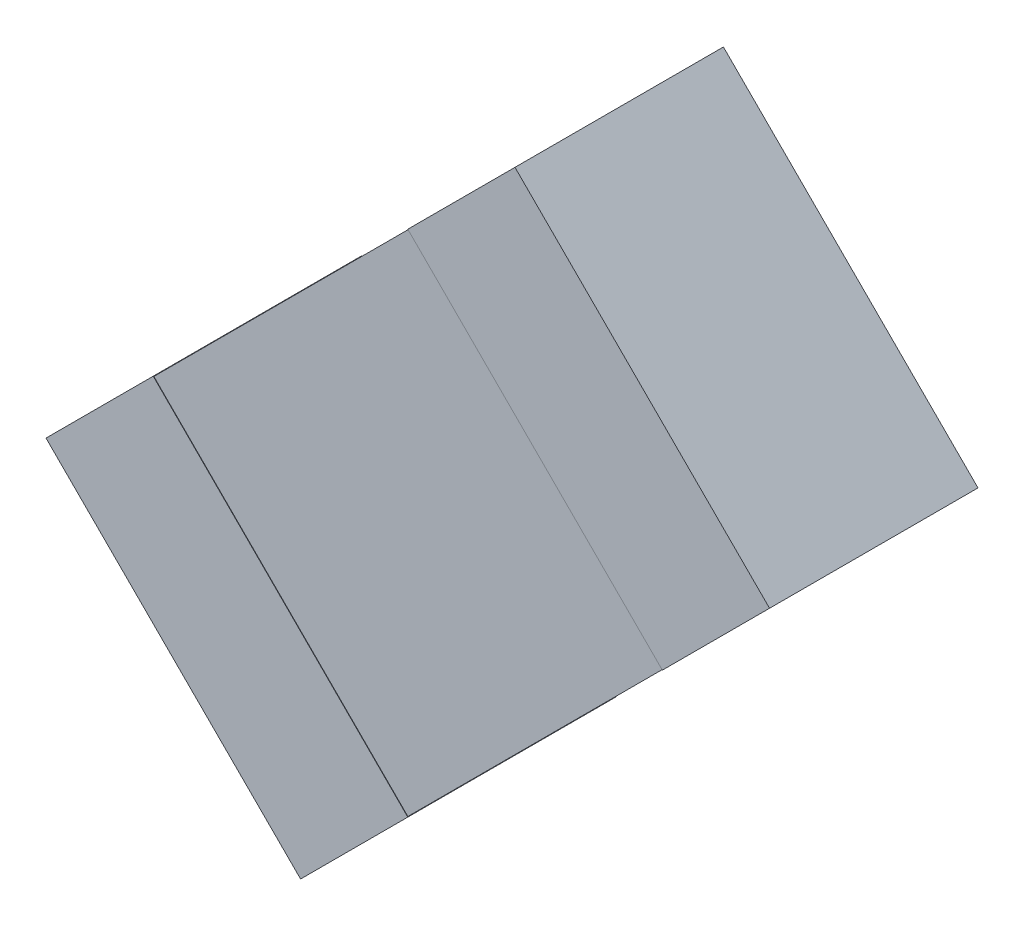
ISO-10303-21;
HEADER;
FILE_DESCRIPTION(('STEP AP214'),'2;1');
FILE_NAME('part.step','',(''),(''),'','','');
FILE_SCHEMA(('AUTOMOTIVE_DESIGN { 1 0 10303 214 1 1 1 1 }'));
ENDSEC;
DATA;
#1=APPLICATION_CONTEXT('core data for automotive mechanical design processes');
#2=APPLICATION_PROTOCOL_DEFINITION('international standard','automotive_design',2000,#1);
#3=PRODUCT_CONTEXT('',#1,'mechanical');
#4=PRODUCT('Part','Part','',(#3));
#5=PRODUCT_RELATED_PRODUCT_CATEGORY('part','',(#4));
#6=PRODUCT_DEFINITION_FORMATION('','',#4);
#7=PRODUCT_DEFINITION_CONTEXT('part definition',#1,'design');
#8=PRODUCT_DEFINITION('design','',#6,#7);
#9=PRODUCT_DEFINITION_SHAPE('','',#8);
#10=(LENGTH_UNIT() NAMED_UNIT(*) SI_UNIT(.MILLI.,.METRE.));
#11=(NAMED_UNIT(*) PLANE_ANGLE_UNIT() SI_UNIT($,.RADIAN.));
#12=(NAMED_UNIT(*) SI_UNIT($,.STERADIAN.) SOLID_ANGLE_UNIT());
#13=UNCERTAINTY_MEASURE_WITH_UNIT(LENGTH_MEASURE(1.E-05),#10,'distance_accuracy_value','');
#14=(GEOMETRIC_REPRESENTATION_CONTEXT(3) GLOBAL_UNCERTAINTY_ASSIGNED_CONTEXT((#13)) GLOBAL_UNIT_ASSIGNED_CONTEXT((#10,
#11,#12)) REPRESENTATION_CONTEXT('',''));
#15=CARTESIAN_POINT('',(0.,0.,0.));
#16=DIRECTION('',(0.,0.,1.));
#17=DIRECTION('',(1.,0.,0.));
#18=AXIS2_PLACEMENT_3D('',#15,#16,#17);
#19=CARTESIAN_POINT('',(26.0197262084034,0.55010577926265,2.53731114527116));
#20=DIRECTION('',(-0.707106721582045,0.707106840791045,0.));
#21=DIRECTION('',(0.,0.,-1.));
#22=AXIS2_PLACEMENT_3D('',#19,#20,#21);
#23=PLANE('',#22);
#24=DIRECTION('',(0.707106840791045,0.707106721582045,0.));
#25=VECTOR('',#24,1.);
#26=CARTESIAN_POINT('',(282868.172679483,282842.655375552,2.53731114527116));
#27=LINE('',#26,#25);
#28=CARTESIAN_POINT('',(25.7722388141082,0.302618426690659,2.53731114527122));
#29=VERTEX_POINT('',#28);
#30=CARTESIAN_POINT('',(26.0197262084035,0.550105779262705,2.53731114527122));
#31=VERTEX_POINT('',#30);
#32=EDGE_CURVE('E276',#29,#31,#27,.T.);
#33=ORIENTED_EDGE('',*,*,#32,.F.);
#34=DIRECTION('',(0.,0.,-1.));
#35=VECTOR('',#34,1.);
#36=CARTESIAN_POINT('',(25.7722388141081,0.302618426690548,291601.756716946));
#37=LINE('',#36,#35);
#38=CARTESIAN_POINT('',(25.7722388141082,0.302618426690659,2.58731114525904));
#39=VERTEX_POINT('',#38);
#40=EDGE_CURVE('E28',#39,#29,#37,.T.);
#41=ORIENTED_EDGE('',*,*,#40,.F.);
#42=DIRECTION('',(-0.707106840791045,-0.707106721582045,0.));
#43=VECTOR('',#42,1.);
#44=CARTESIAN_POINT('',(282868.172679483,282842.655375552,2.58731114525917));
#45=LINE('',#44,#43);
#46=CARTESIAN_POINT('',(26.0550815504344,0.585461115333197,2.58731114525904));
#47=VERTEX_POINT('',#46);
#48=EDGE_CURVE('E335',#47,#39,#45,.T.);
#49=ORIENTED_EDGE('',*,*,#48,.F.);
#50=DIRECTION('',(0.,0.,1.));
#51=VECTOR('',#50,1.);
#52=CARTESIAN_POINT('',(26.0550815504344,0.585461115333252,291601.756716946));
#53=LINE('',#52,#51);
#54=CARTESIAN_POINT('',(26.0550815504344,0.585461115333197,2.03731114528316));
#55=VERTEX_POINT('',#54);
#56=EDGE_CURVE('E1057',#55,#47,#53,.T.);
#57=ORIENTED_EDGE('',*,*,#56,.F.);
#58=DIRECTION('',(0.707106840791045,0.707106721582045,0.));
#59=VECTOR('',#58,1.);
#60=CARTESIAN_POINT('',(282868.172679483,282842.655375552,2.03731114528316));
#61=LINE('',#60,#59);
#62=CARTESIAN_POINT('',(25.7722388141082,0.302618426690659,2.03731114528316));
#63=VERTEX_POINT('',#62);
#64=EDGE_CURVE('E1075',#63,#55,#61,.T.);
#65=ORIENTED_EDGE('',*,*,#64,.F.);
#66=CARTESIAN_POINT('',(25.7722388141082,0.302618426690659,2.08731114526974));
#67=VERTEX_POINT('',#66);
#68=EDGE_CURVE('E340',#67,#63,#37,.T.);
#69=ORIENTED_EDGE('',*,*,#68,.F.);
#70=DIRECTION('',(-0.707106840791045,-0.707106721582045,0.));
#71=VECTOR('',#70,1.);
#72=CARTESIAN_POINT('',(282868.172679483,282842.655375552,2.08731114527062));
#73=LINE('',#72,#71);
#74=CARTESIAN_POINT('',(26.0197262084035,0.550105779262705,2.08731114526886));
#75=VERTEX_POINT('',#74);
#76=EDGE_CURVE('E397',#75,#67,#73,.T.);
#77=ORIENTED_EDGE('',*,*,#76,.F.);
#78=DIRECTION('',(0.,0.,-1.));
#79=VECTOR('',#78,1.);
#80=CARTESIAN_POINT('',(26.0197262084034,0.55010577926265,291601.756716946));
#81=LINE('',#80,#79);
#82=EDGE_CURVE('E342',#31,#75,#81,.T.);
#83=ORIENTED_EDGE('',*,*,#82,.F.);
#84=EDGE_LOOP('',(#33,#41,#49,#57,#65,#69,#77,#83));
#85=FACE_BOUND('',#84,.T.);
#86=ADVANCED_FACE('F17',(#85),#23,.T.);
#87=CARTESIAN_POINT('',(26.6914775939063,-0.121645719488833,2.53731114527116));
#88=DIRECTION('',(-0.707106721582045,0.707106840791045,0.));
#89=DIRECTION('',(0.,0.,-1.));
#90=AXIS2_PLACEMENT_3D('',#87,#88,#89);
#91=PLANE('',#90);
#92=DIRECTION('',(0.707106840791045,0.707106721582045,0.));
#93=VECTOR('',#92,1.);
#94=CARTESIAN_POINT('',(282868.844430869,282841.983624053,2.53731114527116));
#95=LINE('',#94,#93);
#96=CARTESIAN_POINT('',(26.4439901996111,-0.369133072060837,2.53731114527122));
#97=VERTEX_POINT('',#96);
#98=CARTESIAN_POINT('',(26.6914775939064,-0.121645719488778,2.53731114527122));
#99=VERTEX_POINT('',#98);
#100=EDGE_CURVE('E252',#97,#99,#95,.T.);
#101=ORIENTED_EDGE('',*,*,#100,.T.);
#102=DIRECTION('',(0.,0.,-1.));
#103=VECTOR('',#102,1.);
#104=CARTESIAN_POINT('',(26.6914775939063,-0.121645719488833,291601.756716946));
#105=LINE('',#104,#103);
#106=CARTESIAN_POINT('',(26.6914775939064,-0.121645719488778,2.08731114526886));
#107=VERTEX_POINT('',#106);
#108=EDGE_CURVE('E283',#99,#107,#105,.T.);
#109=ORIENTED_EDGE('',*,*,#108,.T.);
#110=DIRECTION('',(-0.707106840791045,-0.707106721582045,0.));
#111=VECTOR('',#110,1.);
#112=CARTESIAN_POINT('',(26.6914775939063,-0.121645719488833,2.08731114527062));
#113=LINE('',#112,#111);
#114=CARTESIAN_POINT('',(26.4439901996111,-0.369133072060837,2.08731114526974));
#115=VERTEX_POINT('',#114);
#116=EDGE_CURVE('E369',#107,#115,#113,.T.);
#117=ORIENTED_EDGE('',*,*,#116,.T.);
#118=DIRECTION('',(0.,0.,-1.));
#119=VECTOR('',#118,1.);
#120=CARTESIAN_POINT('',(26.443990199611,-0.369133072060948,291601.756716946));
#121=LINE('',#120,#119);
#122=CARTESIAN_POINT('',(26.4439901996111,-0.369133072060837,2.03731114528316));
#123=VERTEX_POINT('',#122);
#124=EDGE_CURVE('E436',#115,#123,#121,.T.);
#125=ORIENTED_EDGE('',*,*,#124,.T.);
#126=DIRECTION('',(0.707106840791045,0.707106721582045,0.));
#127=VECTOR('',#126,1.);
#128=CARTESIAN_POINT('',(282868.844430869,282841.983624053,2.03731114528316));
#129=LINE('',#128,#127);
#130=CARTESIAN_POINT('',(26.7268329359373,-0.086290383418286,2.03731114528316));
#131=VERTEX_POINT('',#130);
#132=EDGE_CURVE('E1060',#123,#131,#129,.T.);
#133=ORIENTED_EDGE('',*,*,#132,.T.);
#134=DIRECTION('',(0.,0.,1.));
#135=VECTOR('',#134,1.);
#136=CARTESIAN_POINT('',(26.7268329359374,-0.0862903834182305,291601.756716946));
#137=LINE('',#136,#135);
#138=CARTESIAN_POINT('',(26.7268329359373,-0.086290383418286,2.58731114525904));
#139=VERTEX_POINT('',#138);
#140=EDGE_CURVE('E1050',#131,#139,#137,.T.);
#141=ORIENTED_EDGE('',*,*,#140,.T.);
#142=DIRECTION('',(-0.707106840791045,-0.707106721582045,0.));
#143=VECTOR('',#142,1.);
#144=CARTESIAN_POINT('',(282868.844430869,282841.983624053,2.58731114525917));
#145=LINE('',#144,#143);
#146=CARTESIAN_POINT('',(26.4439901996111,-0.369133072060837,2.58731114525904));
#147=VERTEX_POINT('',#146);
#148=EDGE_CURVE('E255',#139,#147,#145,.T.);
#149=ORIENTED_EDGE('',*,*,#148,.T.);
#150=EDGE_CURVE('E41',#147,#97,#121,.T.);
#151=ORIENTED_EDGE('',*,*,#150,.T.);
#152=EDGE_LOOP('',(#101,#109,#117,#125,#133,#141,#149,#151));
#153=FACE_BOUND('',#152,.T.);
#154=ADVANCED_FACE('F249',(#153),#91,.F.);
#155=CARTESIAN_POINT('',(26.443990199611,-0.369133072060948,291601.756716946));
#156=DIRECTION('',(0.707106840791045,0.707106721582045,0.));
#157=DIRECTION('',(0.,0.,1.));
#158=AXIS2_PLACEMENT_3D('',#155,#156,#157);
#159=PLANE('',#158);
#160=DIRECTION('',(-0.707106721582045,0.707106840791045,0.));
#161=VECTOR('',#160,1.);
#162=CARTESIAN_POINT('',(26.4425759861679,-0.367718858379356,2.58631114526117));
#163=LINE('',#162,#161);
#164=CARTESIAN_POINT('',(26.4432830928897,-0.368425965219993,2.58631114526117));
#165=VERTEX_POINT('',#164);
#166=CARTESIAN_POINT('',(25.7729459208297,0.301911319849746,2.58631114526124));
#167=VERTEX_POINT('',#166);
#168=EDGE_CURVE('E367',#165,#167,#163,.T.);
#169=ORIENTED_EDGE('',*,*,#168,.F.);
#170=DIRECTION('',(0.,0.,1.));
#171=VECTOR('',#170,1.);
#172=CARTESIAN_POINT('',(26.4432830928895,-0.36842596522016,2.08731114527062));
#173=LINE('',#172,#171);
#174=CARTESIAN_POINT('',(26.4432830928897,-0.368425965219993,2.53731114527116));
#175=VERTEX_POINT('',#174);
#176=EDGE_CURVE('E258',#165,#175,#173,.F.);
#177=ORIENTED_EDGE('',*,*,#176,.T.);
#178=DIRECTION('',(-0.707106721582045,0.707106840791045,0.));
#179=VECTOR('',#178,1.);
#180=CARTESIAN_POINT('',(26.443990199611,-0.369133072060948,2.53731114527116));
#181=LINE('',#180,#179);
#182=EDGE_CURVE('E261',#97,#175,#181,.T.);
#183=ORIENTED_EDGE('',*,*,#182,.F.);
#184=ORIENTED_EDGE('',*,*,#150,.F.);
#185=DIRECTION('',(-0.707106721582045,0.707106840791045,0.));
#186=VECTOR('',#185,1.);
#187=CARTESIAN_POINT('',(26.443990199611,-0.369133072060948,2.58731114525917));
#188=LINE('',#187,#186);
#189=EDGE_CURVE('E598',#147,#39,#188,.T.);
#190=ORIENTED_EDGE('',*,*,#189,.T.);
#191=ORIENTED_EDGE('',*,*,#40,.T.);
#192=CARTESIAN_POINT('',(25.7729459208098,0.3019113198299,2.5373111452712));
#193=VERTEX_POINT('',#192);
#194=EDGE_CURVE('E602',#193,#29,#181,.T.);
#195=ORIENTED_EDGE('',*,*,#194,.F.);
#196=DIRECTION('',(0.,0.,-1.));
#197=VECTOR('',#196,1.);
#198=CARTESIAN_POINT('',(25.7729459208297,0.301911319849746,291601.756716946));
#199=LINE('',#198,#197);
#200=EDGE_CURVE('E11',#193,#167,#199,.F.);
#201=ORIENTED_EDGE('',*,*,#200,.T.);
#202=EDGE_LOOP('',(#169,#177,#183,#184,#190,#191,#195,#201));
#203=FACE_BOUND('',#202,.T.);
#204=ADVANCED_FACE('F263',(#203),#159,.F.);
#205=CARTESIAN_POINT('',(282868.844430869,282841.983624053,2.58731114525917));
#206=DIRECTION('',(0.,0.,-1.));
#207=DIRECTION('',(0.707106840791045,0.707106721582045,0.));
#208=AXIS2_PLACEMENT_3D('',#205,#206,#207);
#209=PLANE('',#208);
#210=ORIENTED_EDGE('',*,*,#48,.T.);
#211=ORIENTED_EDGE('',*,*,#189,.F.);
#212=ORIENTED_EDGE('',*,*,#148,.F.);
#213=DIRECTION('',(-0.707106721582045,0.707106840791045,0.));
#214=VECTOR('',#213,1.);
#215=CARTESIAN_POINT('',(26.7268329359374,-0.0862903834182305,2.58731114525917));
#216=LINE('',#215,#214);
#217=EDGE_CURVE('E1047',#139,#47,#216,.T.);
#218=ORIENTED_EDGE('',*,*,#217,.T.);
#219=EDGE_LOOP('',(#210,#211,#212,#218));
#220=FACE_BOUND('',#219,.T.);
#221=ADVANCED_FACE('F703',(#220),#209,.F.);
#222=CARTESIAN_POINT('',(26.7268329359374,-0.0862903834182305,291601.756716946));
#223=DIRECTION('',(-0.707106840791045,-0.707106721582045,0.));
#224=DIRECTION('',(0.,0.,-1.));
#225=AXIS2_PLACEMENT_3D('',#222,#223,#224);
#226=PLANE('',#225);
#227=ORIENTED_EDGE('',*,*,#56,.T.);
#228=ORIENTED_EDGE('',*,*,#217,.F.);
#229=ORIENTED_EDGE('',*,*,#140,.F.);
#230=DIRECTION('',(-0.707106721582045,0.707106840791045,0.));
#231=VECTOR('',#230,1.);
#232=CARTESIAN_POINT('',(26.7268329359374,-0.0862903834182305,2.03731114528316));
#233=LINE('',#232,#231);
#234=EDGE_CURVE('E1081',#131,#55,#233,.T.);
#235=ORIENTED_EDGE('',*,*,#234,.T.);
#236=EDGE_LOOP('',(#227,#228,#229,#235));
#237=FACE_BOUND('',#236,.T.);
#238=ADVANCED_FACE('F704',(#237),#226,.F.);
#239=CARTESIAN_POINT('',(282868.844430869,282841.983624053,2.03731114528316));
#240=DIRECTION('',(0.,0.,1.));
#241=DIRECTION('',(-0.707106840791045,-0.707106721582045,0.));
#242=AXIS2_PLACEMENT_3D('',#239,#240,#241);
#243=PLANE('',#242);
#244=ORIENTED_EDGE('',*,*,#64,.T.);
#245=ORIENTED_EDGE('',*,*,#234,.F.);
#246=ORIENTED_EDGE('',*,*,#132,.F.);
#247=DIRECTION('',(-0.707106721582045,0.707106840791045,0.));
#248=VECTOR('',#247,1.);
#249=CARTESIAN_POINT('',(26.443990199611,-0.369133072060948,2.03731114528316));
#250=LINE('',#249,#248);
#251=EDGE_CURVE('E458',#123,#63,#250,.T.);
#252=ORIENTED_EDGE('',*,*,#251,.T.);
#253=EDGE_LOOP('',(#244,#245,#246,#252));
#254=FACE_BOUND('',#253,.T.);
#255=ADVANCED_FACE('F707',(#254),#243,.F.);
#256=ORIENTED_EDGE('',*,*,#68,.T.);
#257=ORIENTED_EDGE('',*,*,#251,.F.);
#258=ORIENTED_EDGE('',*,*,#124,.F.);
#259=DIRECTION('',(-0.707106721582045,0.707106840791045,0.));
#260=VECTOR('',#259,1.);
#261=CARTESIAN_POINT('',(26.443990199611,-0.369133072060948,2.08731114527061));
#262=LINE('',#261,#260);
#263=CARTESIAN_POINT('',(26.4432830928896,-0.368425965220049,2.08731114526995));
#264=VERTEX_POINT('',#263);
#265=EDGE_CURVE('E373',#115,#264,#262,.T.);
#266=ORIENTED_EDGE('',*,*,#265,.T.);
#267=DIRECTION('',(-0.707106721582045,0.707106840791045,0.));
#268=VECTOR('',#267,1.);
#269=CARTESIAN_POINT('',(26.443990199611,-0.369133072060948,2.08731114527062));
#270=LINE('',#269,#268);
#271=CARTESIAN_POINT('',(25.7729459208299,0.301911319849912,2.08731114527062));
#272=VERTEX_POINT('',#271);
#273=EDGE_CURVE('E376',#264,#272,#270,.T.);
#274=ORIENTED_EDGE('',*,*,#273,.T.);
#275=EDGE_CURVE('E347',#272,#67,#262,.T.);
#276=ORIENTED_EDGE('',*,*,#275,.T.);
#277=EDGE_LOOP('',(#256,#257,#258,#266,#274,#276));
#278=FACE_BOUND('',#277,.T.);
#279=ADVANCED_FACE('F432',(#278),#159,.F.);
#280=CARTESIAN_POINT('',(282868.844430869,282841.983624053,2.08731114527062));
#281=DIRECTION('',(0.,0.,1.));
#282=DIRECTION('',(-0.707106840791045,-0.707106721582045,0.));
#283=AXIS2_PLACEMENT_3D('',#280,#281,#282);
#284=PLANE('',#283);
#285=DIRECTION('',(0.707106840791045,0.707106721582045,0.));
#286=VECTOR('',#285,1.);
#287=CARTESIAN_POINT('',(26.6907704871847,-0.120938612648058,2.08731114527062));
#288=LINE('',#287,#286);
#289=CARTESIAN_POINT('',(26.6907704871847,-0.120938612648058,2.08731114526886));
#290=VERTEX_POINT('',#289);
#291=EDGE_CURVE('E381',#264,#290,#288,.T.);
#292=ORIENTED_EDGE('',*,*,#291,.F.);
#293=ORIENTED_EDGE('',*,*,#265,.F.);
#294=ORIENTED_EDGE('',*,*,#116,.F.);
#295=DIRECTION('',(-0.707106721582045,0.707106840791045,0.));
#296=VECTOR('',#295,1.);
#297=CARTESIAN_POINT('',(26.6914775939065,-0.121645719488639,2.08731114527062));
#298=LINE('',#297,#296);
#299=EDGE_CURVE('E268',#107,#290,#298,.T.);
#300=ORIENTED_EDGE('',*,*,#299,.T.);
#301=EDGE_LOOP('',(#292,#293,#294,#300));
#302=FACE_BOUND('',#301,.T.);
#303=ADVANCED_FACE('F438',(#302),#284,.T.);
#304=CARTESIAN_POINT('',(26.6914775939063,-0.121645719488833,291601.756716946));
#305=DIRECTION('',(0.707106840791045,0.707106721582045,0.));
#306=DIRECTION('',(0.,0.,1.));
#307=AXIS2_PLACEMENT_3D('',#304,#305,#306);
#308=PLANE('',#307);
#309=DIRECTION('',(0.,0.,1.));
#310=VECTOR('',#309,1.);
#311=CARTESIAN_POINT('',(26.6907704871847,-0.120938612648058,291601.756716946));
#312=LINE('',#311,#310);
#313=CARTESIAN_POINT('',(26.6907704871847,-0.120938612648058,2.53731114527116));
#314=VERTEX_POINT('',#313);
#315=EDGE_CURVE('E385',#290,#314,#312,.T.);
#316=ORIENTED_EDGE('',*,*,#315,.F.);
#317=ORIENTED_EDGE('',*,*,#299,.F.);
#318=ORIENTED_EDGE('',*,*,#108,.F.);
#319=DIRECTION('',(-0.707106721582045,0.707106840791045,0.));
#320=VECTOR('',#319,1.);
#321=CARTESIAN_POINT('',(26.6914775939063,-0.121645719488833,2.53731114527116));
#322=LINE('',#321,#320);
#323=EDGE_CURVE('E271',#99,#314,#322,.T.);
#324=ORIENTED_EDGE('',*,*,#323,.T.);
#325=EDGE_LOOP('',(#316,#317,#318,#324));
#326=FACE_BOUND('',#325,.T.);
#327=ADVANCED_FACE('F443',(#326),#308,.F.);
#328=CARTESIAN_POINT('',(282868.844430869,282841.983624053,2.53731114527116));
#329=DIRECTION('',(0.,0.,1.));
#330=DIRECTION('',(-0.707106840791045,-0.707106721582045,0.));
#331=AXIS2_PLACEMENT_3D('',#328,#329,#330);
#332=PLANE('',#331);
#333=DIRECTION('',(-0.707106840791045,-0.707106721582045,0.));
#334=VECTOR('',#333,1.);
#335=CARTESIAN_POINT('',(282868.843723761,282841.98433116,2.53731114527116));
#336=LINE('',#335,#334);
#337=EDGE_CURVE('E445',#314,#175,#336,.T.);
#338=ORIENTED_EDGE('',*,*,#337,.F.);
#339=ORIENTED_EDGE('',*,*,#323,.F.);
#340=ORIENTED_EDGE('',*,*,#100,.F.);
#341=ORIENTED_EDGE('',*,*,#182,.T.);
#342=EDGE_LOOP('',(#338,#339,#340,#341));
#343=FACE_BOUND('',#342,.T.);
#344=ADVANCED_FACE('F270',(#343),#332,.F.);
#345=CARTESIAN_POINT('',(26.020433315125,0.549398672421847,2.53731114527116));
#346=VERTEX_POINT('',#345);
#347=EDGE_CURVE('E215',#346,#31,#322,.T.);
#348=ORIENTED_EDGE('',*,*,#347,.F.);
#349=DIRECTION('',(-0.707106840791045,-0.707106721582045,0.));
#350=VECTOR('',#349,1.);
#351=CARTESIAN_POINT('',(282868.17338659,282842.654668445,2.53731114527116));
#352=LINE('',#351,#350);
#353=EDGE_CURVE('E467',#346,#193,#352,.T.);
#354=ORIENTED_EDGE('',*,*,#353,.T.);
#355=ORIENTED_EDGE('',*,*,#194,.T.);
#356=ORIENTED_EDGE('',*,*,#32,.T.);
#357=EDGE_LOOP('',(#348,#354,#355,#356));
#358=FACE_BOUND('',#357,.T.);
#359=ADVANCED_FACE('F690',(#358),#332,.F.);
#360=ORIENTED_EDGE('',*,*,#275,.F.);
#361=DIRECTION('',(0.707106840791045,0.707106721582045,0.));
#362=VECTOR('',#361,1.);
#363=CARTESIAN_POINT('',(282868.17338659,282842.654668445,2.08731114527062));
#364=LINE('',#363,#362);
#365=CARTESIAN_POINT('',(26.020433315125,0.54939867242193,2.08731114526974));
#366=VERTEX_POINT('',#365);
#367=EDGE_CURVE('E477',#272,#366,#364,.T.);
#368=ORIENTED_EDGE('',*,*,#367,.T.);
#369=EDGE_CURVE('E387',#366,#75,#298,.T.);
#370=ORIENTED_EDGE('',*,*,#369,.T.);
#371=ORIENTED_EDGE('',*,*,#76,.T.);
#372=EDGE_LOOP('',(#360,#368,#370,#371));
#373=FACE_BOUND('',#372,.T.);
#374=ADVANCED_FACE('F679',(#373),#284,.T.);
#375=ORIENTED_EDGE('',*,*,#369,.F.);
#376=DIRECTION('',(0.,0.,1.));
#377=VECTOR('',#376,1.);
#378=CARTESIAN_POINT('',(26.020433315125,0.549398672421847,291601.756716946));
#379=LINE('',#378,#377);
#380=EDGE_CURVE('E470',#366,#346,#379,.T.);
#381=ORIENTED_EDGE('',*,*,#380,.T.);
#382=ORIENTED_EDGE('',*,*,#347,.T.);
#383=ORIENTED_EDGE('',*,*,#82,.T.);
#384=EDGE_LOOP('',(#375,#381,#382,#383));
#385=FACE_BOUND('',#384,.T.);
#386=ADVANCED_FACE('F689',(#385),#308,.F.);
#387=CARTESIAN_POINT('',(24.8529999210698,-0.616620311376007,2.08731114527062));
#388=DIRECTION('',(-0.707106721582045,0.707106840791045,0.));
#389=DIRECTION('',(0.,0.,-1.));
#390=AXIS2_PLACEMENT_3D('',#387,#388,#389);
#391=PLANE('',#390);
#392=CARTESIAN_POINT('',(25.100487315365,-0.369132958804017,2.08731114527149));
#393=VERTEX_POINT('',#392);
#394=CARTESIAN_POINT('',(24.8529999210698,-0.616620311376076,2.08731114527149));
#395=VERTEX_POINT('',#394);
#396=EDGE_CURVE('E391',#393,#395,#73,.T.);
#397=ORIENTED_EDGE('',*,*,#396,.F.);
#398=DIRECTION('',(0.,0.,1.));
#399=VECTOR('',#398,1.);
#400=CARTESIAN_POINT('',(25.1004873153651,-0.369132958803906,291601.756716946));
#401=LINE('',#400,#399);
#402=CARTESIAN_POINT('',(25.100487315365,-0.369132958804017,2.03731114528316));
#403=VERTEX_POINT('',#402);
#404=EDGE_CURVE('E305',#403,#393,#401,.T.);
#405=ORIENTED_EDGE('',*,*,#404,.F.);
#406=CARTESIAN_POINT('',(24.8176445790388,-0.651975647446568,2.03731114528316));
#407=VERTEX_POINT('',#406);
#408=EDGE_CURVE('E311',#407,#403,#61,.T.);
#409=ORIENTED_EDGE('',*,*,#408,.F.);
#410=DIRECTION('',(0.,0.,-1.));
#411=VECTOR('',#410,1.);
#412=CARTESIAN_POINT('',(24.8176445790388,-0.651975647446623,291601.756716946));
#413=LINE('',#412,#411);
#414=CARTESIAN_POINT('',(24.8176445790388,-0.651975647446568,2.58731114525904));
#415=VERTEX_POINT('',#414);
#416=EDGE_CURVE('E535',#415,#407,#413,.T.);
#417=ORIENTED_EDGE('',*,*,#416,.F.);
#418=CARTESIAN_POINT('',(25.100487315365,-0.369132958804017,2.58731114525904));
#419=VERTEX_POINT('',#418);
#420=EDGE_CURVE('E296',#419,#415,#45,.T.);
#421=ORIENTED_EDGE('',*,*,#420,.F.);
#422=CARTESIAN_POINT('',(25.100487315365,-0.369132958804017,2.53731114527122));
#423=VERTEX_POINT('',#422);
#424=EDGE_CURVE('E316',#423,#419,#401,.T.);
#425=ORIENTED_EDGE('',*,*,#424,.F.);
#426=CARTESIAN_POINT('',(24.8529999210698,-0.616620311376076,2.53731114527122));
#427=VERTEX_POINT('',#426);
#428=EDGE_CURVE('E318',#427,#423,#27,.T.);
#429=ORIENTED_EDGE('',*,*,#428,.F.);
#430=DIRECTION('',(0.,0.,1.));
#431=VECTOR('',#430,1.);
#432=CARTESIAN_POINT('',(24.8529999210698,-0.616620311376007,291601.756716946));
#433=LINE('',#432,#431);
#434=EDGE_CURVE('E326',#395,#427,#433,.T.);
#435=ORIENTED_EDGE('',*,*,#434,.F.);
#436=EDGE_LOOP('',(#397,#405,#409,#417,#421,#425,#429,#435));
#437=FACE_BOUND('',#436,.T.);
#438=ADVANCED_FACE('F714',(#437),#391,.T.);
#439=CARTESIAN_POINT('',(25.5247513065728,-1.2883718101275,2.08731114527062));
#440=DIRECTION('',(-0.707106721582045,0.707106840791045,0.));
#441=DIRECTION('',(0.,0.,-1.));
#442=AXIS2_PLACEMENT_3D('',#439,#440,#441);
#443=PLANE('',#442);
#444=DIRECTION('',(-0.707106840791045,-0.707106721582045,0.));
#445=VECTOR('',#444,1.);
#446=CARTESIAN_POINT('',(25.5247513065728,-1.2883718101275,2.08731114527062));
#447=LINE('',#446,#445);
#448=CARTESIAN_POINT('',(25.7722387008679,-1.04088445755551,2.08731114527149));
#449=VERTEX_POINT('',#448);
#450=CARTESIAN_POINT('',(25.5247513065727,-1.28837181012757,2.08731114527149));
#451=VERTEX_POINT('',#450);
#452=EDGE_CURVE('E398',#449,#451,#447,.T.);
#453=ORIENTED_EDGE('',*,*,#452,.T.);
#454=DIRECTION('',(0.,0.,1.));
#455=VECTOR('',#454,1.);
#456=CARTESIAN_POINT('',(25.5247513065728,-1.2883718101275,291601.756716946));
#457=LINE('',#456,#455);
#458=CARTESIAN_POINT('',(25.5247513065727,-1.28837181012757,2.53731114527122));
#459=VERTEX_POINT('',#458);
#460=EDGE_CURVE('E518',#451,#459,#457,.T.);
#461=ORIENTED_EDGE('',*,*,#460,.T.);
#462=CARTESIAN_POINT('',(25.7722387008679,-1.04088445755551,2.53731114527122));
#463=VERTEX_POINT('',#462);
#464=EDGE_CURVE('E288',#459,#463,#95,.T.);
#465=ORIENTED_EDGE('',*,*,#464,.T.);
#466=DIRECTION('',(0.,0.,1.));
#467=VECTOR('',#466,1.);
#468=CARTESIAN_POINT('',(25.772238700868,-1.0408844575554,291601.756716946));
#469=LINE('',#468,#467);
#470=CARTESIAN_POINT('',(25.7722387008679,-1.04088445755551,2.58731114525904));
#471=VERTEX_POINT('',#470);
#472=EDGE_CURVE('E290',#463,#471,#469,.T.);
#473=ORIENTED_EDGE('',*,*,#472,.T.);
#474=CARTESIAN_POINT('',(25.4893959645418,-1.32372714619805,2.58731114525904));
#475=VERTEX_POINT('',#474);
#476=EDGE_CURVE('E298',#471,#475,#145,.T.);
#477=ORIENTED_EDGE('',*,*,#476,.T.);
#478=DIRECTION('',(0.,0.,-1.));
#479=VECTOR('',#478,1.);
#480=CARTESIAN_POINT('',(25.4893959645417,-1.32372714619812,291601.756716946));
#481=LINE('',#480,#479);
#482=CARTESIAN_POINT('',(25.4893959645418,-1.32372714619805,2.03731114528316));
#483=VERTEX_POINT('',#482);
#484=EDGE_CURVE('E534',#475,#483,#481,.T.);
#485=ORIENTED_EDGE('',*,*,#484,.T.);
#486=CARTESIAN_POINT('',(25.7722387008679,-1.04088445755551,2.03731114528316));
#487=VERTEX_POINT('',#486);
#488=EDGE_CURVE('E310',#483,#487,#129,.T.);
#489=ORIENTED_EDGE('',*,*,#488,.T.);
#490=EDGE_CURVE('E303',#487,#449,#469,.T.);
#491=ORIENTED_EDGE('',*,*,#490,.T.);
#492=EDGE_LOOP('',(#453,#461,#465,#473,#477,#485,#489,#491));
#493=FACE_BOUND('',#492,.T.);
#494=ADVANCED_FACE('F652',(#493),#443,.F.);
#495=CARTESIAN_POINT('',(25.772238700868,-1.0408844575554,291601.756716946));
#496=DIRECTION('',(-0.707106840791045,-0.707106721582045,0.));
#497=DIRECTION('',(0.,0.,-1.));
#498=AXIS2_PLACEMENT_3D('',#495,#496,#497);
#499=PLANE('',#498);
#500=ORIENTED_EDGE('',*,*,#404,.T.);
#501=DIRECTION('',(-0.707106721582045,0.707106840791045,0.));
#502=VECTOR('',#501,1.);
#503=CARTESIAN_POINT('',(25.7722387008677,-1.04088445755572,2.08731114527062));
#504=LINE('',#503,#502);
#505=CARTESIAN_POINT('',(25.1011944220866,-0.369840065644861,2.08731114527062));
#506=VERTEX_POINT('',#505);
#507=EDGE_CURVE('E396',#506,#393,#504,.T.);
#508=ORIENTED_EDGE('',*,*,#507,.F.);
#509=DIRECTION('',(-0.707106721582045,0.707106840791045,0.));
#510=VECTOR('',#509,1.);
#511=CARTESIAN_POINT('',(25.772238700868,-1.0408844575554,2.08731114527062));
#512=LINE('',#511,#510);
#513=CARTESIAN_POINT('',(25.7715315941463,-1.04017735071477,2.08731114527062));
#514=VERTEX_POINT('',#513);
#515=EDGE_CURVE('E403',#514,#506,#512,.T.);
#516=ORIENTED_EDGE('',*,*,#515,.F.);
#517=EDGE_CURVE('E402',#449,#514,#504,.T.);
#518=ORIENTED_EDGE('',*,*,#517,.F.);
#519=ORIENTED_EDGE('',*,*,#490,.F.);
#520=DIRECTION('',(-0.707106721582045,0.707106840791045,0.));
#521=VECTOR('',#520,1.);
#522=CARTESIAN_POINT('',(25.772238700868,-1.0408844575554,2.03731114528316));
#523=LINE('',#522,#521);
#524=EDGE_CURVE('E538',#487,#403,#523,.T.);
#525=ORIENTED_EDGE('',*,*,#524,.T.);
#526=EDGE_LOOP('',(#500,#508,#516,#518,#519,#525));
#527=FACE_BOUND('',#526,.T.);
#528=ADVANCED_FACE('F666',(#527),#499,.F.);
#529=ORIENTED_EDGE('',*,*,#408,.T.);
#530=ORIENTED_EDGE('',*,*,#524,.F.);
#531=ORIENTED_EDGE('',*,*,#488,.F.);
#532=DIRECTION('',(-0.707106721582045,0.707106840791045,0.));
#533=VECTOR('',#532,1.);
#534=CARTESIAN_POINT('',(25.4893959645417,-1.32372714619812,2.03731114528316));
#535=LINE('',#534,#533);
#536=EDGE_CURVE('E530',#483,#407,#535,.T.);
#537=ORIENTED_EDGE('',*,*,#536,.T.);
#538=EDGE_LOOP('',(#529,#530,#531,#537));
#539=FACE_BOUND('',#538,.T.);
#540=ADVANCED_FACE('F664',(#539),#243,.F.);
#541=CARTESIAN_POINT('',(25.4893959645417,-1.32372714619812,291601.756716946));
#542=DIRECTION('',(0.707106840791045,0.707106721582045,0.));
#543=DIRECTION('',(0.,0.,1.));
#544=AXIS2_PLACEMENT_3D('',#541,#542,#543);
#545=PLANE('',#544);
#546=ORIENTED_EDGE('',*,*,#416,.T.);
#547=ORIENTED_EDGE('',*,*,#536,.F.);
#548=ORIENTED_EDGE('',*,*,#484,.F.);
#549=DIRECTION('',(-0.707106721582045,0.707106840791045,0.));
#550=VECTOR('',#549,1.);
#551=CARTESIAN_POINT('',(25.4893959645417,-1.32372714619812,2.58731114525917));
#552=LINE('',#551,#550);
#553=EDGE_CURVE('E524',#475,#415,#552,.T.);
#554=ORIENTED_EDGE('',*,*,#553,.T.);
#555=EDGE_LOOP('',(#546,#547,#548,#554));
#556=FACE_BOUND('',#555,.T.);
#557=ADVANCED_FACE('F662',(#556),#545,.F.);
#558=ORIENTED_EDGE('',*,*,#420,.T.);
#559=ORIENTED_EDGE('',*,*,#553,.F.);
#560=ORIENTED_EDGE('',*,*,#476,.F.);
#561=DIRECTION('',(-0.707106721582045,0.707106840791045,0.));
#562=VECTOR('',#561,1.);
#563=CARTESIAN_POINT('',(25.772238700868,-1.0408844575554,2.58731114525917));
#564=LINE('',#563,#562);
#565=EDGE_CURVE('E297',#471,#419,#564,.T.);
#566=ORIENTED_EDGE('',*,*,#565,.T.);
#567=EDGE_LOOP('',(#558,#559,#560,#566));
#568=FACE_BOUND('',#567,.T.);
#569=ADVANCED_FACE('F657',(#568),#209,.F.);
#570=DIRECTION('',(0.,0.,-1.));
#571=VECTOR('',#570,1.);
#572=CARTESIAN_POINT('',(25.7715315941465,-1.04017735071461,2.08731114527062));
#573=LINE('',#572,#571);
#574=CARTESIAN_POINT('',(25.7715315941464,-1.0401773507147,2.53731114527116));
#575=VERTEX_POINT('',#574);
#576=CARTESIAN_POINT('',(25.7715315941463,-1.04017735071477,2.58631114526117));
#577=VERTEX_POINT('',#576);
#578=EDGE_CURVE('E350',#575,#577,#573,.F.);
#579=ORIENTED_EDGE('',*,*,#578,.T.);
#580=DIRECTION('',(-0.707106721582045,0.707106840791045,0.));
#581=VECTOR('',#580,1.);
#582=CARTESIAN_POINT('',(25.7708244874249,-1.03947024387382,2.58631114526117));
#583=LINE('',#582,#581);
#584=CARTESIAN_POINT('',(25.1011944220867,-0.369840065644694,2.58631114526124));
#585=VERTEX_POINT('',#584);
#586=EDGE_CURVE('E361',#577,#585,#583,.T.);
#587=ORIENTED_EDGE('',*,*,#586,.T.);
#588=DIRECTION('',(0.,0.,1.));
#589=VECTOR('',#588,1.);
#590=CARTESIAN_POINT('',(25.1011944220867,-0.369840065644694,291601.756716946));
#591=LINE('',#590,#589);
#592=CARTESIAN_POINT('',(25.1011944220664,-0.369840065664956,2.5373111452712));
#593=VERTEX_POINT('',#592);
#594=EDGE_CURVE('E353',#585,#593,#591,.F.);
#595=ORIENTED_EDGE('',*,*,#594,.T.);
#596=DIRECTION('',(-0.707106721582045,0.707106840791045,0.));
#597=VECTOR('',#596,1.);
#598=CARTESIAN_POINT('',(25.772238700868,-1.0408844575554,2.53731114527116));
#599=LINE('',#598,#597);
#600=EDGE_CURVE('E325',#593,#423,#599,.T.);
#601=ORIENTED_EDGE('',*,*,#600,.T.);
#602=ORIENTED_EDGE('',*,*,#424,.T.);
#603=ORIENTED_EDGE('',*,*,#565,.F.);
#604=ORIENTED_EDGE('',*,*,#472,.F.);
#605=EDGE_CURVE('E513',#463,#575,#599,.T.);
#606=ORIENTED_EDGE('',*,*,#605,.T.);
#607=EDGE_LOOP('',(#579,#587,#595,#601,#602,#603,#604,#606));
#608=FACE_BOUND('',#607,.T.);
#609=ADVANCED_FACE('F655',(#608),#499,.F.);
#610=DIRECTION('',(-0.707106840791045,-0.707106721582045,0.));
#611=VECTOR('',#610,1.);
#612=CARTESIAN_POINT('',(26.6907704871847,-0.120938612648058,2.53731114527116));
#613=LINE('',#612,#611);
#614=CARTESIAN_POINT('',(25.5240441998512,-1.28766470328671,2.53731114527116));
#615=VERTEX_POINT('',#614);
#616=EDGE_CURVE('E449',#575,#615,#613,.T.);
#617=ORIENTED_EDGE('',*,*,#616,.F.);
#618=ORIENTED_EDGE('',*,*,#605,.F.);
#619=ORIENTED_EDGE('',*,*,#464,.F.);
#620=DIRECTION('',(-0.707106721582045,0.707106840791045,0.));
#621=VECTOR('',#620,1.);
#622=CARTESIAN_POINT('',(25.5247513065728,-1.2883718101275,2.53731114527116));
#623=LINE('',#622,#621);
#624=EDGE_CURVE('E410',#459,#615,#623,.T.);
#625=ORIENTED_EDGE('',*,*,#624,.T.);
#626=EDGE_LOOP('',(#617,#618,#619,#625));
#627=FACE_BOUND('',#626,.T.);
#628=ADVANCED_FACE('F557',(#627),#332,.F.);
#629=CARTESIAN_POINT('',(25.5247513065728,-1.2883718101275,291601.756716946));
#630=DIRECTION('',(-0.707106840791045,-0.707106721582045,0.));
#631=DIRECTION('',(0.,0.,-1.));
#632=AXIS2_PLACEMENT_3D('',#629,#630,#631);
#633=PLANE('',#632);
#634=DIRECTION('',(0.,0.,-1.));
#635=VECTOR('',#634,1.);
#636=CARTESIAN_POINT('',(25.5240441998512,-1.28766470328671,291601.756716946));
#637=LINE('',#636,#635);
#638=CARTESIAN_POINT('',(25.5240441998512,-1.28766470328678,2.08731114527062));
#639=VERTEX_POINT('',#638);
#640=EDGE_CURVE('E498',#615,#639,#637,.T.);
#641=ORIENTED_EDGE('',*,*,#640,.F.);
#642=ORIENTED_EDGE('',*,*,#624,.F.);
#643=ORIENTED_EDGE('',*,*,#460,.F.);
#644=DIRECTION('',(-0.707106721582045,0.707106840791045,0.));
#645=VECTOR('',#644,1.);
#646=CARTESIAN_POINT('',(25.5247513065728,-1.2883718101275,2.08731114527061));
#647=LINE('',#646,#645);
#648=EDGE_CURVE('E324',#451,#639,#647,.T.);
#649=ORIENTED_EDGE('',*,*,#648,.T.);
#650=EDGE_LOOP('',(#641,#642,#643,#649));
#651=FACE_BOUND('',#650,.T.);
#652=ADVANCED_FACE('F562',(#651),#633,.F.);
#653=EDGE_CURVE('E386',#639,#514,#288,.T.);
#654=ORIENTED_EDGE('',*,*,#653,.F.);
#655=ORIENTED_EDGE('',*,*,#648,.F.);
#656=ORIENTED_EDGE('',*,*,#452,.F.);
#657=ORIENTED_EDGE('',*,*,#517,.T.);
#658=EDGE_LOOP('',(#654,#655,#656,#657));
#659=FACE_BOUND('',#658,.T.);
#660=ADVANCED_FACE('F671',(#659),#284,.T.);
#661=ORIENTED_EDGE('',*,*,#600,.F.);
#662=DIRECTION('',(-0.707106840791045,-0.707106721582045,0.));
#663=VECTOR('',#662,1.);
#664=CARTESIAN_POINT('',(26.020433315125,0.549398672421847,2.53731114527116));
#665=LINE('',#664,#663);
#666=CARTESIAN_POINT('',(24.8537070277914,-0.617327418216795,2.53731114527116));
#667=VERTEX_POINT('',#666);
#668=EDGE_CURVE('E471',#593,#667,#665,.T.);
#669=ORIENTED_EDGE('',*,*,#668,.T.);
#670=EDGE_CURVE('E395',#667,#427,#623,.T.);
#671=ORIENTED_EDGE('',*,*,#670,.T.);
#672=ORIENTED_EDGE('',*,*,#428,.T.);
#673=EDGE_LOOP('',(#661,#669,#671,#672));
#674=FACE_BOUND('',#673,.T.);
#675=ADVANCED_FACE('F678',(#674),#332,.F.);
#676=ORIENTED_EDGE('',*,*,#670,.F.);
#677=DIRECTION('',(0.,0.,-1.));
#678=VECTOR('',#677,1.);
#679=CARTESIAN_POINT('',(24.8537070277914,-0.617327418216795,291601.756716946));
#680=LINE('',#679,#678);
#681=CARTESIAN_POINT('',(24.8537070277913,-0.617327418216865,2.08731114527062));
#682=VERTEX_POINT('',#681);
#683=EDGE_CURVE('E479',#667,#682,#680,.T.);
#684=ORIENTED_EDGE('',*,*,#683,.T.);
#685=EDGE_CURVE('E360',#682,#395,#647,.T.);
#686=ORIENTED_EDGE('',*,*,#685,.T.);
#687=ORIENTED_EDGE('',*,*,#434,.T.);
#688=EDGE_LOOP('',(#676,#684,#686,#687));
#689=FACE_BOUND('',#688,.T.);
#690=ADVANCED_FACE('F685',(#689),#633,.F.);
#691=ORIENTED_EDGE('',*,*,#685,.F.);
#692=EDGE_CURVE('E21',#682,#506,#364,.T.);
#693=ORIENTED_EDGE('',*,*,#692,.T.);
#694=ORIENTED_EDGE('',*,*,#507,.T.);
#695=ORIENTED_EDGE('',*,*,#396,.T.);
#696=EDGE_LOOP('',(#691,#693,#694,#695));
#697=FACE_BOUND('',#696,.T.);
#698=ADVANCED_FACE('F19',(#697),#284,.T.);
#699=CARTESIAN_POINT('',(282868.843016655,282841.985038267,2.58631114526117));
#700=DIRECTION('',(0.,0.,-1.));
#701=DIRECTION('',(0.707106840791045,0.707106721582045,0.));
#702=AXIS2_PLACEMENT_3D('',#699,#700,#701);
#703=PLANE('',#702);
#704=ORIENTED_EDGE('',*,*,#168,.T.);
#705=DIRECTION('',(0.707106840791045,0.707106721582045,0.));
#706=VECTOR('',#705,1.);
#707=CARTESIAN_POINT('',(26.020433315125,0.549398672421847,2.58631114526117));
#708=LINE('',#707,#706);
#709=EDGE_CURVE('E364',#167,#585,#708,.F.);
#710=ORIENTED_EDGE('',*,*,#709,.T.);
#711=ORIENTED_EDGE('',*,*,#586,.F.);
#712=DIRECTION('',(-0.707106840791045,-0.707106721582045,0.));
#713=VECTOR('',#712,1.);
#714=CARTESIAN_POINT('',(282868.843723761,282841.98433116,2.58631114526117));
#715=LINE('',#714,#713);
#716=EDGE_CURVE('E356',#577,#165,#715,.F.);
#717=ORIENTED_EDGE('',*,*,#716,.T.);
#718=EDGE_LOOP('',(#704,#710,#711,#717));
#719=FACE_BOUND('',#718,.T.);
#720=ADVANCED_FACE('F692',(#719),#703,.F.);
#721=CARTESIAN_POINT('',(26.020433315125,0.549398672421847,2.08731114527062));
#722=DIRECTION('',(0.707106721582045,-0.707106840791045,0.));
#723=DIRECTION('',(0.,0.,1.));
#724=AXIS2_PLACEMENT_3D('',#721,#722,#723);
#725=PLANE('',#724);
#726=ORIENTED_EDGE('',*,*,#692,.F.);
#727=ORIENTED_EDGE('',*,*,#683,.F.);
#728=ORIENTED_EDGE('',*,*,#668,.F.);
#729=ORIENTED_EDGE('',*,*,#594,.F.);
#730=ORIENTED_EDGE('',*,*,#709,.F.);
#731=ORIENTED_EDGE('',*,*,#200,.F.);
#732=ORIENTED_EDGE('',*,*,#353,.F.);
#733=ORIENTED_EDGE('',*,*,#380,.F.);
#734=ORIENTED_EDGE('',*,*,#367,.F.);
#735=EDGE_CURVE('E407',#506,#272,#364,.T.);
#736=ORIENTED_EDGE('',*,*,#735,.F.);
#737=EDGE_LOOP('',(#726,#727,#728,#729,#730,#731,#732,#733,#734,#736));
#738=FACE_BOUND('',#737,.T.);
#739=ADVANCED_FACE('F730',(#738),#725,.F.);
#740=CARTESIAN_POINT('',(26.6907704871847,-0.120938612648058,2.08731114527062));
#741=DIRECTION('',(0.707106721582045,-0.707106840791045,0.));
#742=DIRECTION('',(0.,0.,1.));
#743=AXIS2_PLACEMENT_3D('',#740,#741,#742);
#744=PLANE('',#743);
#745=ORIENTED_EDGE('',*,*,#653,.T.);
#746=DIRECTION('',(0.707106840791045,0.707106721582045,0.));
#747=VECTOR('',#746,1.);
#748=CARTESIAN_POINT('',(282868.843723761,282841.98433116,2.08731114527062));
#749=LINE('',#748,#747);
#750=EDGE_CURVE('E380',#514,#264,#749,.T.);
#751=ORIENTED_EDGE('',*,*,#750,.T.);
#752=ORIENTED_EDGE('',*,*,#291,.T.);
#753=ORIENTED_EDGE('',*,*,#315,.T.);
#754=ORIENTED_EDGE('',*,*,#337,.T.);
#755=ORIENTED_EDGE('',*,*,#176,.F.);
#756=ORIENTED_EDGE('',*,*,#716,.F.);
#757=ORIENTED_EDGE('',*,*,#578,.F.);
#758=ORIENTED_EDGE('',*,*,#616,.T.);
#759=ORIENTED_EDGE('',*,*,#640,.T.);
#760=EDGE_LOOP('',(#745,#751,#752,#753,#754,#755,#756,#757,#758,#759));
#761=FACE_BOUND('',#760,.T.);
#762=ADVANCED_FACE('F419',(#761),#744,.T.);
#763=CARTESIAN_POINT('',(282868.844430869,282841.983624053,2.08731114527062));
#764=DIRECTION('',(0.,0.,1.));
#765=DIRECTION('',(-0.707106840791045,-0.707106721582045,0.));
#766=AXIS2_PLACEMENT_3D('',#763,#764,#765);
#767=PLANE('',#766);
#768=ORIENTED_EDGE('',*,*,#273,.F.);
#769=ORIENTED_EDGE('',*,*,#750,.F.);
#770=ORIENTED_EDGE('',*,*,#515,.T.);
#771=ORIENTED_EDGE('',*,*,#735,.T.);
#772=EDGE_LOOP('',(#768,#769,#770,#771));
#773=FACE_BOUND('',#772,.T.);
#774=ADVANCED_FACE('F427',(#773),#767,.F.);
#775=CLOSED_SHELL('',(#86,#154,#204,#221,#238,#255,#279,#303,#327,#344,#359,#374,#386,#438,#494,
#528,#540,#557,#569,#609,#628,#652,#660,#675,#690,#698,#720,#739,#762,#774));
#776=MANIFOLD_SOLID_BREP('B1',#775);
#777=ADVANCED_BREP_SHAPE_REPRESENTATION('',(#18,#776),#14);
#778=SHAPE_DEFINITION_REPRESENTATION(#9,#777);
ENDSEC;
END-ISO-10303-21;
